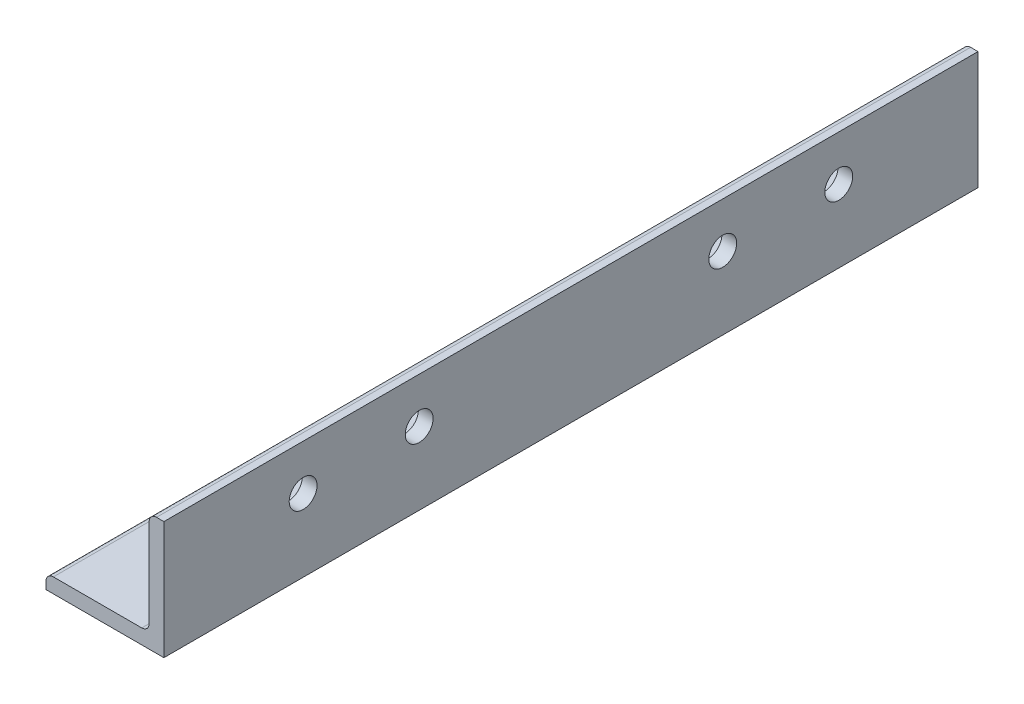
ISO-10303-21;
HEADER;
FILE_DESCRIPTION(('STEP AP214'),'2;1');
FILE_NAME('part.step','',(''),(''),'','','');
FILE_SCHEMA(('AUTOMOTIVE_DESIGN { 1 0 10303 214 1 1 1 1 }'));
ENDSEC;
DATA;
#1=APPLICATION_CONTEXT('core data for automotive mechanical design processes');
#2=APPLICATION_PROTOCOL_DEFINITION('international standard','automotive_design',2000,#1);
#3=PRODUCT_CONTEXT('',#1,'mechanical');
#4=PRODUCT('Part','Part','',(#3));
#5=PRODUCT_RELATED_PRODUCT_CATEGORY('part','',(#4));
#6=PRODUCT_DEFINITION_FORMATION('','',#4);
#7=PRODUCT_DEFINITION_CONTEXT('part definition',#1,'design');
#8=PRODUCT_DEFINITION('design','',#6,#7);
#9=PRODUCT_DEFINITION_SHAPE('','',#8);
#10=(LENGTH_UNIT() NAMED_UNIT(*) SI_UNIT(.MILLI.,.METRE.));
#11=(NAMED_UNIT(*) PLANE_ANGLE_UNIT() SI_UNIT($,.RADIAN.));
#12=(NAMED_UNIT(*) SI_UNIT($,.STERADIAN.) SOLID_ANGLE_UNIT());
#13=UNCERTAINTY_MEASURE_WITH_UNIT(LENGTH_MEASURE(1.E-05),#10,'distance_accuracy_value','');
#14=(GEOMETRIC_REPRESENTATION_CONTEXT(3) GLOBAL_UNCERTAINTY_ASSIGNED_CONTEXT((#13)) GLOBAL_UNIT_ASSIGNED_CONTEXT((#10,
#11,#12)) REPRESENTATION_CONTEXT('',''));
#15=CARTESIAN_POINT('',(0.,0.,0.));
#16=DIRECTION('',(0.,0.,1.));
#17=DIRECTION('',(1.,0.,0.));
#18=AXIS2_PLACEMENT_3D('',#15,#16,#17);
#19=CARTESIAN_POINT('',(-12.7,0.,87.698453));
#20=DIRECTION('',(0.,1.,0.));
#21=DIRECTION('',(0.,0.,1.));
#22=AXIS2_PLACEMENT_3D('',#19,#20,#21);
#23=PLANE('',#22);
#24=DIRECTION('',(1.,0.,0.));
#25=VECTOR('',#24,1.);
#26=CARTESIAN_POINT('',(-12.7,0.,-87.698453));
#27=LINE('',#26,#25);
#28=CARTESIAN_POINT('',(-12.7,0.,-87.698453));
#29=VERTEX_POINT('',#28);
#30=CARTESIAN_POINT('',(12.7,0.,-87.698453));
#31=VERTEX_POINT('',#30);
#32=EDGE_CURVE('E153',#29,#31,#27,.T.);
#33=ORIENTED_EDGE('',*,*,#32,.T.);
#34=DIRECTION('',(0.,0.,-1.));
#35=VECTOR('',#34,1.);
#36=CARTESIAN_POINT('',(12.7,0.,87.698453));
#37=LINE('',#36,#35);
#38=CARTESIAN_POINT('',(12.7,0.,87.698453));
#39=VERTEX_POINT('',#38);
#40=EDGE_CURVE('E49',#39,#31,#37,.T.);
#41=ORIENTED_EDGE('',*,*,#40,.F.);
#42=DIRECTION('',(1.,0.,0.));
#43=VECTOR('',#42,1.);
#44=CARTESIAN_POINT('',(-12.7,0.,87.698453));
#45=LINE('',#44,#43);
#46=CARTESIAN_POINT('',(-12.7,0.,87.698453));
#47=VERTEX_POINT('',#46);
#48=EDGE_CURVE('E104',#47,#39,#45,.T.);
#49=ORIENTED_EDGE('',*,*,#48,.F.);
#50=DIRECTION('',(0.,0.,-1.));
#51=VECTOR('',#50,1.);
#52=CARTESIAN_POINT('',(-12.7,0.,87.698453));
#53=LINE('',#52,#51);
#54=EDGE_CURVE('E11',#47,#29,#53,.T.);
#55=ORIENTED_EDGE('',*,*,#54,.T.);
#56=EDGE_LOOP('',(#33,#41,#49,#55));
#57=FACE_BOUND('',#56,.T.);
#58=CARTESIAN_POINT('',(0.,0.,37.698453));
#59=DIRECTION('',(0.,1.,0.));
#60=DIRECTION('',(0.,0.,1.));
#61=AXIS2_PLACEMENT_3D('',#58,#59,#60);
#62=CIRCLE('',#61,3.175);
#63=CARTESIAN_POINT('',(0.,0.,40.873453));
#64=VERTEX_POINT('',#63);
#65=EDGE_CURVE('E205',#64,#64,#62,.T.);
#66=ORIENTED_EDGE('',*,*,#65,.T.);
#67=EDGE_LOOP('',(#66));
#68=FACE_BOUND('',#67,.T.);
#69=CARTESIAN_POINT('',(0.,0.,-37.698453));
#70=DIRECTION('',(0.,-1.,0.));
#71=DIRECTION('',(0.,0.,-1.));
#72=AXIS2_PLACEMENT_3D('',#69,#70,#71);
#73=CIRCLE('',#72,3.175);
#74=CARTESIAN_POINT('',(0.,0.,-40.873453));
#75=VERTEX_POINT('',#74);
#76=EDGE_CURVE('E198',#75,#75,#73,.T.);
#77=ORIENTED_EDGE('',*,*,#76,.F.);
#78=EDGE_LOOP('',(#77));
#79=FACE_BOUND('',#78,.T.);
#80=ADVANCED_FACE('F38',(#57,#68,#79),#23,.F.);
#81=CARTESIAN_POINT('',(7.9375,3.175,87.698453));
#82=DIRECTION('',(0.,-1.,0.));
#83=DIRECTION('',(1.,0.,0.));
#84=AXIS2_PLACEMENT_3D('',#81,#82,#83);
#85=PLANE('',#84);
#86=DIRECTION('',(-1.,0.,0.));
#87=VECTOR('',#86,1.);
#88=CARTESIAN_POINT('',(7.9375,3.175,-87.698453));
#89=LINE('',#88,#87);
#90=CARTESIAN_POINT('',(7.9375,3.175,-87.698453));
#91=VERTEX_POINT('',#90);
#92=CARTESIAN_POINT('',(-11.1125,3.175,-87.698453));
#93=VERTEX_POINT('',#92);
#94=EDGE_CURVE('E90',#91,#93,#89,.T.);
#95=ORIENTED_EDGE('',*,*,#94,.T.);
#96=DIRECTION('',(0.,0.,-1.));
#97=VECTOR('',#96,1.);
#98=CARTESIAN_POINT('',(-11.1125,3.175,87.698453));
#99=LINE('',#98,#97);
#100=CARTESIAN_POINT('',(-11.1125,3.175,87.698453));
#101=VERTEX_POINT('',#100);
#102=EDGE_CURVE('E138',#101,#93,#99,.T.);
#103=ORIENTED_EDGE('',*,*,#102,.F.);
#104=DIRECTION('',(-1.,0.,0.));
#105=VECTOR('',#104,1.);
#106=CARTESIAN_POINT('',(7.9375,3.175,87.698453));
#107=LINE('',#106,#105);
#108=CARTESIAN_POINT('',(7.9375,3.175,87.698453));
#109=VERTEX_POINT('',#108);
#110=EDGE_CURVE('E124',#109,#101,#107,.T.);
#111=ORIENTED_EDGE('',*,*,#110,.F.);
#112=DIRECTION('',(0.,0.,-1.));
#113=VECTOR('',#112,1.);
#114=CARTESIAN_POINT('',(7.9375,3.175,87.698453));
#115=LINE('',#114,#113);
#116=EDGE_CURVE('E132',#109,#91,#115,.T.);
#117=ORIENTED_EDGE('',*,*,#116,.T.);
#118=EDGE_LOOP('',(#95,#103,#111,#117));
#119=FACE_BOUND('',#118,.T.);
#120=CARTESIAN_POINT('',(0.,3.175,37.698453));
#121=DIRECTION('',(0.,-1.,0.));
#122=DIRECTION('',(1.,0.,0.));
#123=AXIS2_PLACEMENT_3D('',#120,#121,#122);
#124=CIRCLE('',#123,3.175);
#125=CARTESIAN_POINT('',(3.175,3.175,37.698453));
#126=VERTEX_POINT('',#125);
#127=EDGE_CURVE('E195',#126,#126,#124,.F.);
#128=ORIENTED_EDGE('',*,*,#127,.F.);
#129=EDGE_LOOP('',(#128));
#130=FACE_BOUND('',#129,.T.);
#131=CARTESIAN_POINT('',(0.,3.175,-37.698453));
#132=DIRECTION('',(0.,-1.,0.));
#133=DIRECTION('',(1.,0.,0.));
#134=AXIS2_PLACEMENT_3D('',#131,#132,#133);
#135=CIRCLE('',#134,3.175);
#136=CARTESIAN_POINT('',(3.175,3.175,-37.698453));
#137=VERTEX_POINT('',#136);
#138=EDGE_CURVE('E42',#137,#137,#135,.T.);
#139=ORIENTED_EDGE('',*,*,#138,.T.);
#140=EDGE_LOOP('',(#139));
#141=FACE_BOUND('',#140,.T.);
#142=ADVANCED_FACE('F140',(#119,#130,#141),#85,.F.);
#143=CARTESIAN_POINT('',(-12.7,1.5875,87.698453));
#144=DIRECTION('',(1.,0.,0.));
#145=DIRECTION('',(0.,0.,-1.));
#146=AXIS2_PLACEMENT_3D('',#143,#144,#145);
#147=PLANE('',#146);
#148=DIRECTION('',(0.,-1.,0.));
#149=VECTOR('',#148,1.);
#150=CARTESIAN_POINT('',(-12.7,1.5875,-87.698453));
#151=LINE('',#150,#149);
#152=CARTESIAN_POINT('',(-12.7,1.5875,-87.698453));
#153=VERTEX_POINT('',#152);
#154=EDGE_CURVE('E149',#153,#29,#151,.T.);
#155=ORIENTED_EDGE('',*,*,#154,.T.);
#156=ORIENTED_EDGE('',*,*,#54,.F.);
#157=DIRECTION('',(0.,-1.,0.));
#158=VECTOR('',#157,1.);
#159=CARTESIAN_POINT('',(-12.7,1.5875,87.698453));
#160=LINE('',#159,#158);
#161=CARTESIAN_POINT('',(-12.7,1.5875,87.698453));
#162=VERTEX_POINT('',#161);
#163=EDGE_CURVE('E174',#162,#47,#160,.T.);
#164=ORIENTED_EDGE('',*,*,#163,.F.);
#165=DIRECTION('',(0.,0.,-1.));
#166=VECTOR('',#165,1.);
#167=CARTESIAN_POINT('',(-12.7,1.5875,87.698453));
#168=LINE('',#167,#166);
#169=EDGE_CURVE('E145',#162,#153,#168,.T.);
#170=ORIENTED_EDGE('',*,*,#169,.T.);
#171=EDGE_LOOP('',(#155,#156,#164,#170));
#172=FACE_BOUND('',#171,.T.);
#173=ADVANCED_FACE('F40',(#172),#147,.F.);
#174=CARTESIAN_POINT('',(12.7,0.,87.698453));
#175=DIRECTION('',(-1.,0.,0.));
#176=DIRECTION('',(0.,0.,1.));
#177=AXIS2_PLACEMENT_3D('',#174,#175,#176);
#178=PLANE('',#177);
#179=CARTESIAN_POINT('',(12.7,15.6477124044351,-57.698453));
#180=DIRECTION('',(-1.,0.,0.));
#181=DIRECTION('',(0.,0.,1.));
#182=AXIS2_PLACEMENT_3D('',#179,#180,#181);
#183=CIRCLE('',#182,3.);
#184=CARTESIAN_POINT('',(12.7,15.6477124044351,-54.698453));
#185=VERTEX_POINT('',#184);
#186=EDGE_CURVE('E296',#185,#185,#183,.T.);
#187=ORIENTED_EDGE('',*,*,#186,.T.);
#188=EDGE_LOOP('',(#187));
#189=FACE_BOUND('',#188,.T.);
#190=CARTESIAN_POINT('',(12.7,15.6477124044351,57.698453));
#191=DIRECTION('',(-1.,0.,0.));
#192=DIRECTION('',(0.,0.,-1.));
#193=AXIS2_PLACEMENT_3D('',#190,#191,#192);
#194=CIRCLE('',#193,3.);
#195=CARTESIAN_POINT('',(12.7,15.6477124044351,54.698453));
#196=VERTEX_POINT('',#195);
#197=EDGE_CURVE('E304',#196,#196,#194,.T.);
#198=ORIENTED_EDGE('',*,*,#197,.T.);
#199=EDGE_LOOP('',(#198));
#200=FACE_BOUND('',#199,.T.);
#201=CARTESIAN_POINT('',(12.7,15.6477124044351,32.698453));
#202=DIRECTION('',(-1.,0.,0.));
#203=DIRECTION('',(0.,0.,-1.));
#204=AXIS2_PLACEMENT_3D('',#201,#202,#203);
#205=CIRCLE('',#204,3.);
#206=CARTESIAN_POINT('',(12.7,15.6477124044351,29.698453));
#207=VERTEX_POINT('',#206);
#208=EDGE_CURVE('E313',#207,#207,#205,.T.);
#209=ORIENTED_EDGE('',*,*,#208,.T.);
#210=EDGE_LOOP('',(#209));
#211=FACE_BOUND('',#210,.T.);
#212=CARTESIAN_POINT('',(12.7,15.6477124044351,-32.698453));
#213=DIRECTION('',(-1.,0.,0.));
#214=DIRECTION('',(0.,0.,1.));
#215=AXIS2_PLACEMENT_3D('',#212,#213,#214);
#216=CIRCLE('',#215,3.);
#217=CARTESIAN_POINT('',(12.7,15.6477124044351,-29.698453));
#218=VERTEX_POINT('',#217);
#219=EDGE_CURVE('E211',#218,#218,#216,.T.);
#220=ORIENTED_EDGE('',*,*,#219,.T.);
#221=EDGE_LOOP('',(#220));
#222=FACE_BOUND('',#221,.T.);
#223=DIRECTION('',(0.,1.,0.));
#224=VECTOR('',#223,1.);
#225=CARTESIAN_POINT('',(12.7,0.,-87.698453));
#226=LINE('',#225,#224);
#227=CARTESIAN_POINT('',(12.7,25.4,-87.698453));
#228=VERTEX_POINT('',#227);
#229=EDGE_CURVE('E156',#31,#228,#226,.T.);
#230=ORIENTED_EDGE('',*,*,#229,.T.);
#231=DIRECTION('',(0.,0.,-1.));
#232=VECTOR('',#231,1.);
#233=CARTESIAN_POINT('',(12.7,25.4,87.698453));
#234=LINE('',#233,#232);
#235=CARTESIAN_POINT('',(12.7,25.4,87.698453));
#236=VERTEX_POINT('',#235);
#237=EDGE_CURVE('E189',#236,#228,#234,.T.);
#238=ORIENTED_EDGE('',*,*,#237,.F.);
#239=DIRECTION('',(0.,1.,0.));
#240=VECTOR('',#239,1.);
#241=CARTESIAN_POINT('',(12.7,0.,87.698453));
#242=LINE('',#241,#240);
#243=EDGE_CURVE('E221',#39,#236,#242,.T.);
#244=ORIENTED_EDGE('',*,*,#243,.F.);
#245=ORIENTED_EDGE('',*,*,#40,.T.);
#246=EDGE_LOOP('',(#230,#238,#244,#245));
#247=FACE_BOUND('',#246,.T.);
#248=ADVANCED_FACE('F265',(#189,#200,#211,#222,#247),#178,.F.);
#249=CARTESIAN_POINT('',(11.1125,25.4,87.698453));
#250=DIRECTION('',(0.,-1.,0.));
#251=DIRECTION('',(0.,0.,-1.));
#252=AXIS2_PLACEMENT_3D('',#249,#250,#251);
#253=PLANE('',#252);
#254=DIRECTION('',(-1.,0.,0.));
#255=VECTOR('',#254,1.);
#256=CARTESIAN_POINT('',(11.1125,25.4,-87.698453));
#257=LINE('',#256,#255);
#258=CARTESIAN_POINT('',(11.1125,25.4,-87.698453));
#259=VERTEX_POINT('',#258);
#260=EDGE_CURVE('E159',#228,#259,#257,.T.);
#261=ORIENTED_EDGE('',*,*,#260,.T.);
#262=DIRECTION('',(0.,0.,-1.));
#263=VECTOR('',#262,1.);
#264=CARTESIAN_POINT('',(11.1125,25.4,87.698453));
#265=LINE('',#264,#263);
#266=CARTESIAN_POINT('',(11.1125,25.4,87.698453));
#267=VERTEX_POINT('',#266);
#268=EDGE_CURVE('E185',#267,#259,#265,.T.);
#269=ORIENTED_EDGE('',*,*,#268,.F.);
#270=DIRECTION('',(-1.,0.,0.));
#271=VECTOR('',#270,1.);
#272=CARTESIAN_POINT('',(11.1125,25.4,87.698453));
#273=LINE('',#272,#271);
#274=EDGE_CURVE('E224',#236,#267,#273,.T.);
#275=ORIENTED_EDGE('',*,*,#274,.F.);
#276=ORIENTED_EDGE('',*,*,#237,.T.);
#277=EDGE_LOOP('',(#261,#269,#275,#276));
#278=FACE_BOUND('',#277,.T.);
#279=ADVANCED_FACE('F268',(#278),#253,.F.);
#280=CARTESIAN_POINT('',(11.1125,23.8125,87.698453));
#281=DIRECTION('',(0.,0.,-1.));
#282=DIRECTION('',(-1.,0.,0.));
#283=AXIS2_PLACEMENT_3D('',#280,#281,#282);
#284=CYLINDRICAL_SURFACE('',#283,1.5875);
#285=CARTESIAN_POINT('',(11.1125,23.8125,-87.698453));
#286=DIRECTION('',(0.,0.,1.));
#287=DIRECTION('',(-1.,0.,0.));
#288=AXIS2_PLACEMENT_3D('',#285,#286,#287);
#289=CIRCLE('',#288,1.5875);
#290=CARTESIAN_POINT('',(9.525,23.8125,-87.698453));
#291=VERTEX_POINT('',#290);
#292=EDGE_CURVE('E162',#259,#291,#289,.T.);
#293=ORIENTED_EDGE('',*,*,#292,.T.);
#294=DIRECTION('',(0.,0.,-1.));
#295=VECTOR('',#294,1.);
#296=CARTESIAN_POINT('',(9.525,23.8125,87.698453));
#297=LINE('',#296,#295);
#298=CARTESIAN_POINT('',(9.525,23.8125,87.698453));
#299=VERTEX_POINT('',#298);
#300=EDGE_CURVE('E181',#299,#291,#297,.T.);
#301=ORIENTED_EDGE('',*,*,#300,.F.);
#302=CARTESIAN_POINT('',(11.1125,23.8125,87.698453));
#303=DIRECTION('',(0.,0.,1.));
#304=DIRECTION('',(-1.,0.,0.));
#305=AXIS2_PLACEMENT_3D('',#302,#303,#304);
#306=CIRCLE('',#305,1.5875);
#307=EDGE_CURVE('E227',#267,#299,#306,.T.);
#308=ORIENTED_EDGE('',*,*,#307,.F.);
#309=ORIENTED_EDGE('',*,*,#268,.T.);
#310=EDGE_LOOP('',(#293,#301,#308,#309));
#311=FACE_BOUND('',#310,.T.);
#312=ADVANCED_FACE('F235',(#311),#284,.T.);
#313=CARTESIAN_POINT('',(9.525,23.8125,87.698453));
#314=DIRECTION('',(1.,0.,0.));
#315=DIRECTION('',(0.,0.,-1.));
#316=AXIS2_PLACEMENT_3D('',#313,#314,#315);
#317=PLANE('',#316);
#318=CARTESIAN_POINT('',(9.525,15.6477124044351,-57.698453));
#319=DIRECTION('',(-1.,0.,0.));
#320=DIRECTION('',(0.,0.,1.));
#321=AXIS2_PLACEMENT_3D('',#318,#319,#320);
#322=CIRCLE('',#321,3.);
#323=CARTESIAN_POINT('',(9.525,15.6477124044351,-54.698453));
#324=VERTEX_POINT('',#323);
#325=EDGE_CURVE('E283',#324,#324,#322,.T.);
#326=ORIENTED_EDGE('',*,*,#325,.F.);
#327=EDGE_LOOP('',(#326));
#328=FACE_BOUND('',#327,.T.);
#329=CARTESIAN_POINT('',(9.525,15.6477124044351,57.698453));
#330=DIRECTION('',(-1.,0.,0.));
#331=DIRECTION('',(0.,0.,-1.));
#332=AXIS2_PLACEMENT_3D('',#329,#330,#331);
#333=CIRCLE('',#332,3.);
#334=CARTESIAN_POINT('',(9.525,15.6477124044351,54.698453));
#335=VERTEX_POINT('',#334);
#336=EDGE_CURVE('E287',#335,#335,#333,.T.);
#337=ORIENTED_EDGE('',*,*,#336,.F.);
#338=EDGE_LOOP('',(#337));
#339=FACE_BOUND('',#338,.T.);
#340=CARTESIAN_POINT('',(9.525,15.6477124044351,32.698453));
#341=DIRECTION('',(-1.,0.,0.));
#342=DIRECTION('',(0.,0.,-1.));
#343=AXIS2_PLACEMENT_3D('',#340,#341,#342);
#344=CIRCLE('',#343,3.);
#345=CARTESIAN_POINT('',(9.525,15.6477124044351,29.698453));
#346=VERTEX_POINT('',#345);
#347=EDGE_CURVE('E291',#346,#346,#344,.T.);
#348=ORIENTED_EDGE('',*,*,#347,.F.);
#349=EDGE_LOOP('',(#348));
#350=FACE_BOUND('',#349,.T.);
#351=CARTESIAN_POINT('',(9.525,15.6477124044351,-32.698453));
#352=DIRECTION('',(-1.,0.,0.));
#353=DIRECTION('',(0.,0.,1.));
#354=AXIS2_PLACEMENT_3D('',#351,#352,#353);
#355=CIRCLE('',#354,3.);
#356=CARTESIAN_POINT('',(9.525,15.6477124044351,-29.698453));
#357=VERTEX_POINT('',#356);
#358=EDGE_CURVE('E214',#357,#357,#355,.T.);
#359=ORIENTED_EDGE('',*,*,#358,.F.);
#360=EDGE_LOOP('',(#359));
#361=FACE_BOUND('',#360,.T.);
#362=DIRECTION('',(0.,-1.,0.));
#363=VECTOR('',#362,1.);
#364=CARTESIAN_POINT('',(9.525,23.8125,-87.698453));
#365=LINE('',#364,#363);
#366=CARTESIAN_POINT('',(9.525,4.7625,-87.698453));
#367=VERTEX_POINT('',#366);
#368=EDGE_CURVE('E165',#291,#367,#365,.T.);
#369=ORIENTED_EDGE('',*,*,#368,.T.);
#370=DIRECTION('',(0.,0.,-1.));
#371=VECTOR('',#370,1.);
#372=CARTESIAN_POINT('',(9.525,4.7625,87.698453));
#373=LINE('',#372,#371);
#374=CARTESIAN_POINT('',(9.525,4.7625,87.698453));
#375=VERTEX_POINT('',#374);
#376=EDGE_CURVE('E137',#375,#367,#373,.T.);
#377=ORIENTED_EDGE('',*,*,#376,.F.);
#378=DIRECTION('',(0.,-1.,0.));
#379=VECTOR('',#378,1.);
#380=CARTESIAN_POINT('',(9.525,23.8125,87.698453));
#381=LINE('',#380,#379);
#382=EDGE_CURVE('E126',#299,#375,#381,.T.);
#383=ORIENTED_EDGE('',*,*,#382,.F.);
#384=ORIENTED_EDGE('',*,*,#300,.T.);
#385=EDGE_LOOP('',(#369,#377,#383,#384));
#386=FACE_BOUND('',#385,.T.);
#387=ADVANCED_FACE('F239',(#328,#339,#350,#361,#386),#317,.F.);
#388=CARTESIAN_POINT('',(7.93750000000001,4.7625,87.698453));
#389=DIRECTION('',(0.,0.,-1.));
#390=DIRECTION('',(-1.,0.,0.));
#391=AXIS2_PLACEMENT_3D('',#388,#389,#390);
#392=CYLINDRICAL_SURFACE('',#391,1.5875);
#393=CARTESIAN_POINT('',(7.93750000000001,4.7625,-87.698453));
#394=DIRECTION('',(0.,0.,-1.));
#395=DIRECTION('',(-1.,0.,0.));
#396=AXIS2_PLACEMENT_3D('',#393,#394,#395);
#397=CIRCLE('',#396,1.5875);
#398=EDGE_CURVE('E135',#367,#91,#397,.T.);
#399=ORIENTED_EDGE('',*,*,#398,.T.);
#400=ORIENTED_EDGE('',*,*,#116,.F.);
#401=CARTESIAN_POINT('',(7.93750000000001,4.7625,87.698453));
#402=DIRECTION('',(0.,0.,-1.));
#403=DIRECTION('',(-1.,0.,0.));
#404=AXIS2_PLACEMENT_3D('',#401,#402,#403);
#405=CIRCLE('',#404,1.5875);
#406=EDGE_CURVE('E120',#375,#109,#405,.T.);
#407=ORIENTED_EDGE('',*,*,#406,.F.);
#408=ORIENTED_EDGE('',*,*,#376,.T.);
#409=EDGE_LOOP('',(#399,#400,#407,#408));
#410=FACE_BOUND('',#409,.T.);
#411=ADVANCED_FACE('F133',(#410),#392,.F.);
#412=CARTESIAN_POINT('',(-11.1125,1.5875,87.698453));
#413=DIRECTION('',(0.,0.,-1.));
#414=DIRECTION('',(-1.,0.,0.));
#415=AXIS2_PLACEMENT_3D('',#412,#413,#414);
#416=CYLINDRICAL_SURFACE('',#415,1.5875);
#417=CARTESIAN_POINT('',(-11.1125,1.5875,-87.698453));
#418=DIRECTION('',(0.,0.,1.));
#419=DIRECTION('',(-1.,0.,0.));
#420=AXIS2_PLACEMENT_3D('',#417,#418,#419);
#421=CIRCLE('',#420,1.5875);
#422=EDGE_CURVE('E96',#93,#153,#421,.T.);
#423=ORIENTED_EDGE('',*,*,#422,.T.);
#424=ORIENTED_EDGE('',*,*,#169,.F.);
#425=CARTESIAN_POINT('',(-11.1125,1.5875,87.698453));
#426=DIRECTION('',(0.,0.,1.));
#427=DIRECTION('',(-1.,0.,0.));
#428=AXIS2_PLACEMENT_3D('',#425,#426,#427);
#429=CIRCLE('',#428,1.5875);
#430=EDGE_CURVE('E58',#101,#162,#429,.T.);
#431=ORIENTED_EDGE('',*,*,#430,.F.);
#432=ORIENTED_EDGE('',*,*,#102,.T.);
#433=EDGE_LOOP('',(#423,#424,#431,#432));
#434=FACE_BOUND('',#433,.T.);
#435=ADVANCED_FACE('F247',(#434),#416,.T.);
#436=CARTESIAN_POINT('',(11.1125,23.8125,87.698453));
#437=DIRECTION('',(0.,0.,-1.));
#438=DIRECTION('',(-1.,0.,0.));
#439=AXIS2_PLACEMENT_3D('',#436,#437,#438);
#440=PLANE('',#439);
#441=ORIENTED_EDGE('',*,*,#163,.T.);
#442=ORIENTED_EDGE('',*,*,#48,.T.);
#443=ORIENTED_EDGE('',*,*,#243,.T.);
#444=ORIENTED_EDGE('',*,*,#274,.T.);
#445=ORIENTED_EDGE('',*,*,#307,.T.);
#446=ORIENTED_EDGE('',*,*,#382,.T.);
#447=ORIENTED_EDGE('',*,*,#406,.T.);
#448=ORIENTED_EDGE('',*,*,#110,.T.);
#449=ORIENTED_EDGE('',*,*,#430,.T.);
#450=EDGE_LOOP('',(#441,#442,#443,#444,#445,#446,#447,#448,#449));
#451=FACE_BOUND('',#450,.T.);
#452=ADVANCED_FACE('F122',(#451),#440,.F.);
#453=CARTESIAN_POINT('',(11.1125,23.8125,-87.698453));
#454=DIRECTION('',(0.,0.,-1.));
#455=DIRECTION('',(-1.,0.,0.));
#456=AXIS2_PLACEMENT_3D('',#453,#454,#455);
#457=PLANE('',#456);
#458=ORIENTED_EDGE('',*,*,#154,.F.);
#459=ORIENTED_EDGE('',*,*,#422,.F.);
#460=ORIENTED_EDGE('',*,*,#94,.F.);
#461=ORIENTED_EDGE('',*,*,#398,.F.);
#462=ORIENTED_EDGE('',*,*,#368,.F.);
#463=ORIENTED_EDGE('',*,*,#292,.F.);
#464=ORIENTED_EDGE('',*,*,#260,.F.);
#465=ORIENTED_EDGE('',*,*,#229,.F.);
#466=ORIENTED_EDGE('',*,*,#32,.F.);
#467=EDGE_LOOP('',(#458,#459,#460,#461,#462,#463,#464,#465,#466));
#468=FACE_BOUND('',#467,.T.);
#469=ADVANCED_FACE('F242',(#468),#457,.T.);
#470=CARTESIAN_POINT('',(0.,25.4,37.698453));
#471=DIRECTION('',(0.,-1.,0.));
#472=DIRECTION('',(0.,0.,-1.));
#473=AXIS2_PLACEMENT_3D('',#470,#471,#472);
#474=CYLINDRICAL_SURFACE('',#473,3.175);
#475=ORIENTED_EDGE('',*,*,#65,.F.);
#476=EDGE_LOOP('',(#475));
#477=FACE_BOUND('',#476,.T.);
#478=ORIENTED_EDGE('',*,*,#127,.T.);
#479=EDGE_LOOP('',(#478));
#480=FACE_BOUND('',#479,.T.);
#481=ADVANCED_FACE('F343',(#477,#480),#474,.F.);
#482=CARTESIAN_POINT('',(0.,25.4,-37.698453));
#483=DIRECTION('',(0.,-1.,0.));
#484=DIRECTION('',(0.,0.,-1.));
#485=AXIS2_PLACEMENT_3D('',#482,#483,#484);
#486=CYLINDRICAL_SURFACE('',#485,3.175);
#487=ORIENTED_EDGE('',*,*,#76,.T.);
#488=EDGE_LOOP('',(#487));
#489=FACE_BOUND('',#488,.T.);
#490=ORIENTED_EDGE('',*,*,#138,.F.);
#491=EDGE_LOOP('',(#490));
#492=FACE_BOUND('',#491,.T.);
#493=ADVANCED_FACE('F334',(#489,#492),#486,.F.);
#494=CARTESIAN_POINT('',(12.7,15.6477124044351,-32.698453));
#495=DIRECTION('',(-1.,0.,0.));
#496=DIRECTION('',(0.,0.,1.));
#497=AXIS2_PLACEMENT_3D('',#494,#495,#496);
#498=CYLINDRICAL_SURFACE('',#497,3.);
#499=ORIENTED_EDGE('',*,*,#219,.F.);
#500=EDGE_LOOP('',(#499));
#501=FACE_BOUND('',#500,.T.);
#502=ORIENTED_EDGE('',*,*,#358,.T.);
#503=EDGE_LOOP('',(#502));
#504=FACE_BOUND('',#503,.T.);
#505=ADVANCED_FACE('F324',(#501,#504),#498,.F.);
#506=CARTESIAN_POINT('',(12.7,15.6477124044351,32.698453));
#507=DIRECTION('',(-1.,0.,0.));
#508=DIRECTION('',(0.,0.,1.));
#509=AXIS2_PLACEMENT_3D('',#506,#507,#508);
#510=CYLINDRICAL_SURFACE('',#509,3.);
#511=ORIENTED_EDGE('',*,*,#208,.F.);
#512=EDGE_LOOP('',(#511));
#513=FACE_BOUND('',#512,.T.);
#514=ORIENTED_EDGE('',*,*,#347,.T.);
#515=EDGE_LOOP('',(#514));
#516=FACE_BOUND('',#515,.T.);
#517=ADVANCED_FACE('F321',(#513,#516),#510,.F.);
#518=CARTESIAN_POINT('',(12.7,15.6477124044351,57.698453));
#519=DIRECTION('',(-1.,0.,0.));
#520=DIRECTION('',(0.,0.,1.));
#521=AXIS2_PLACEMENT_3D('',#518,#519,#520);
#522=CYLINDRICAL_SURFACE('',#521,3.);
#523=ORIENTED_EDGE('',*,*,#197,.F.);
#524=EDGE_LOOP('',(#523));
#525=FACE_BOUND('',#524,.T.);
#526=ORIENTED_EDGE('',*,*,#336,.T.);
#527=EDGE_LOOP('',(#526));
#528=FACE_BOUND('',#527,.T.);
#529=ADVANCED_FACE('F323',(#525,#528),#522,.F.);
#530=CARTESIAN_POINT('',(12.7,15.6477124044351,-57.698453));
#531=DIRECTION('',(-1.,0.,0.));
#532=DIRECTION('',(0.,0.,1.));
#533=AXIS2_PLACEMENT_3D('',#530,#531,#532);
#534=CYLINDRICAL_SURFACE('',#533,3.);
#535=ORIENTED_EDGE('',*,*,#186,.F.);
#536=EDGE_LOOP('',(#535));
#537=FACE_BOUND('',#536,.T.);
#538=ORIENTED_EDGE('',*,*,#325,.T.);
#539=EDGE_LOOP('',(#538));
#540=FACE_BOUND('',#539,.T.);
#541=ADVANCED_FACE('F331',(#537,#540),#534,.F.);
#542=CLOSED_SHELL('',(#80,#142,#173,#248,#279,#312,#387,#411,#435,#452,#469,#481,#493,#505,#517,
#529,#541));
#543=MANIFOLD_SOLID_BREP('B2',#542);
#544=ADVANCED_BREP_SHAPE_REPRESENTATION('',(#18,#543),#14);
#545=SHAPE_DEFINITION_REPRESENTATION(#9,#544);
ENDSEC;
END-ISO-10303-21;
